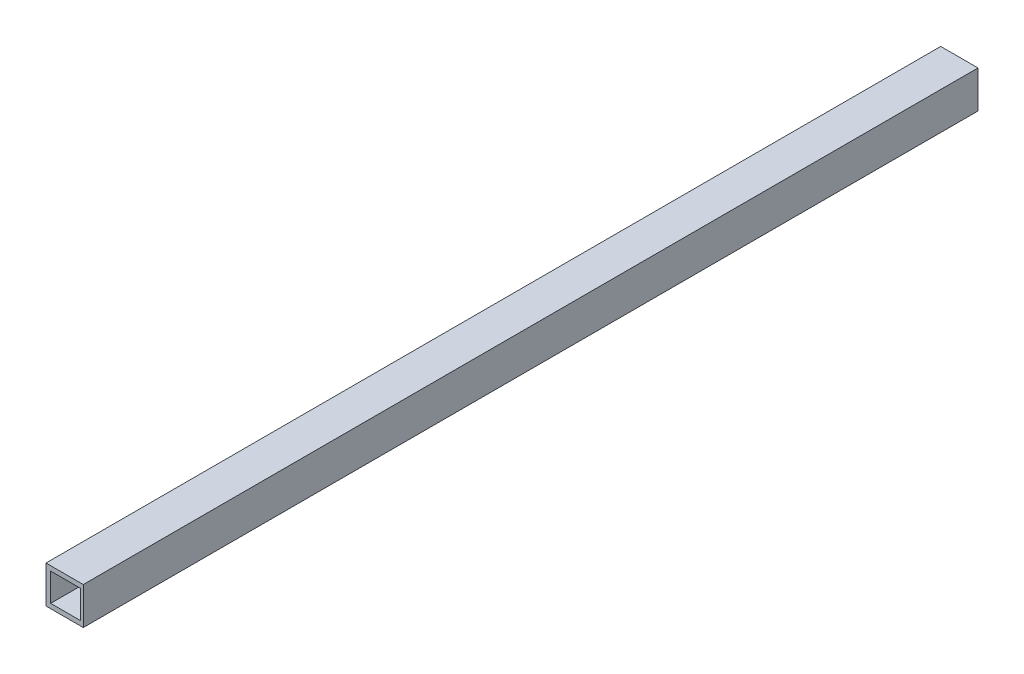
ISO-10303-21;
HEADER;
FILE_DESCRIPTION(('STEP AP214'),'2;1');
FILE_NAME('part.step','',(''),(''),'','','');
FILE_SCHEMA(('AUTOMOTIVE_DESIGN { 1 0 10303 214 1 1 1 1 }'));
ENDSEC;
DATA;
#1=APPLICATION_CONTEXT('core data for automotive mechanical design processes');
#2=APPLICATION_PROTOCOL_DEFINITION('international standard','automotive_design',2000,#1);
#3=PRODUCT_CONTEXT('',#1,'mechanical');
#4=PRODUCT('Part','Part','',(#3));
#5=PRODUCT_RELATED_PRODUCT_CATEGORY('part','',(#4));
#6=PRODUCT_DEFINITION_FORMATION('','',#4);
#7=PRODUCT_DEFINITION_CONTEXT('part definition',#1,'design');
#8=PRODUCT_DEFINITION('design','',#6,#7);
#9=PRODUCT_DEFINITION_SHAPE('','',#8);
#10=(LENGTH_UNIT() NAMED_UNIT(*) SI_UNIT(.MILLI.,.METRE.));
#11=(NAMED_UNIT(*) PLANE_ANGLE_UNIT() SI_UNIT($,.RADIAN.));
#12=(NAMED_UNIT(*) SI_UNIT($,.STERADIAN.) SOLID_ANGLE_UNIT());
#13=UNCERTAINTY_MEASURE_WITH_UNIT(LENGTH_MEASURE(1.E-05),#10,'distance_accuracy_value','');
#14=(GEOMETRIC_REPRESENTATION_CONTEXT(3) GLOBAL_UNCERTAINTY_ASSIGNED_CONTEXT((#13)) GLOBAL_UNIT_ASSIGNED_CONTEXT((#10,
#11,#12)) REPRESENTATION_CONTEXT('',''));
#15=CARTESIAN_POINT('',(0.,0.,0.));
#16=DIRECTION('',(0.,0.,1.));
#17=DIRECTION('',(1.,0.,0.));
#18=AXIS2_PLACEMENT_3D('',#15,#16,#17);
#19=CARTESIAN_POINT('',(0.,0.,609.6));
#20=DIRECTION('',(-1.,0.,0.));
#21=DIRECTION('',(0.,-1.,0.));
#22=AXIS2_PLACEMENT_3D('',#19,#20,#21);
#23=PLANE('',#22);
#24=DIRECTION('',(0.,1.,0.));
#25=VECTOR('',#24,1.);
#26=CARTESIAN_POINT('',(0.,0.,0.));
#27=LINE('',#26,#25);
#28=CARTESIAN_POINT('',(0.,0.,0.));
#29=VERTEX_POINT('',#28);
#30=CARTESIAN_POINT('',(0.,25.4,0.));
#31=VERTEX_POINT('',#30);
#32=EDGE_CURVE('E148',#29,#31,#27,.T.);
#33=ORIENTED_EDGE('',*,*,#32,.F.);
#34=DIRECTION('',(0.,0.,-1.));
#35=VECTOR('',#34,1.);
#36=CARTESIAN_POINT('',(0.,0.,609.6));
#37=LINE('',#36,#35);
#38=CARTESIAN_POINT('',(0.,0.,609.6));
#39=VERTEX_POINT('',#38);
#40=EDGE_CURVE('E11',#39,#29,#37,.T.);
#41=ORIENTED_EDGE('',*,*,#40,.F.);
#42=DIRECTION('',(0.,1.,0.));
#43=VECTOR('',#42,1.);
#44=CARTESIAN_POINT('',(0.,0.,609.6));
#45=LINE('',#44,#43);
#46=CARTESIAN_POINT('',(0.,25.4,609.6));
#47=VERTEX_POINT('',#46);
#48=EDGE_CURVE('E154',#39,#47,#45,.T.);
#49=ORIENTED_EDGE('',*,*,#48,.T.);
#50=DIRECTION('',(0.,0.,-1.));
#51=VECTOR('',#50,1.);
#52=CARTESIAN_POINT('',(0.,25.4,609.6));
#53=LINE('',#52,#51);
#54=EDGE_CURVE('E42',#47,#31,#53,.T.);
#55=ORIENTED_EDGE('',*,*,#54,.T.);
#56=EDGE_LOOP('',(#33,#41,#49,#55));
#57=FACE_BOUND('',#56,.T.);
#58=ADVANCED_FACE('F39',(#57),#23,.T.);
#59=CARTESIAN_POINT('',(0.,0.,609.6));
#60=DIRECTION('',(0.,1.,0.));
#61=DIRECTION('',(0.,0.,1.));
#62=AXIS2_PLACEMENT_3D('',#59,#60,#61);
#63=PLANE('',#62);
#64=DIRECTION('',(1.,0.,0.));
#65=VECTOR('',#64,1.);
#66=CARTESIAN_POINT('',(0.,0.,0.));
#67=LINE('',#66,#65);
#68=CARTESIAN_POINT('',(25.4,0.,0.));
#69=VERTEX_POINT('',#68);
#70=EDGE_CURVE('E159',#29,#69,#67,.T.);
#71=ORIENTED_EDGE('',*,*,#70,.T.);
#72=DIRECTION('',(0.,0.,-1.));
#73=VECTOR('',#72,1.);
#74=CARTESIAN_POINT('',(25.4,0.,609.6));
#75=LINE('',#74,#73);
#76=CARTESIAN_POINT('',(25.4,0.,609.6));
#77=VERTEX_POINT('',#76);
#78=EDGE_CURVE('E48',#77,#69,#75,.T.);
#79=ORIENTED_EDGE('',*,*,#78,.F.);
#80=DIRECTION('',(1.,0.,0.));
#81=VECTOR('',#80,1.);
#82=CARTESIAN_POINT('',(0.,0.,609.6));
#83=LINE('',#82,#81);
#84=EDGE_CURVE('E166',#39,#77,#83,.T.);
#85=ORIENTED_EDGE('',*,*,#84,.F.);
#86=ORIENTED_EDGE('',*,*,#40,.T.);
#87=EDGE_LOOP('',(#71,#79,#85,#86));
#88=FACE_BOUND('',#87,.T.);
#89=ADVANCED_FACE('F201',(#88),#63,.F.);
#90=CARTESIAN_POINT('',(25.4,0.,609.6));
#91=DIRECTION('',(-1.,0.,0.));
#92=DIRECTION('',(0.,-1.,0.));
#93=AXIS2_PLACEMENT_3D('',#90,#91,#92);
#94=PLANE('',#93);
#95=DIRECTION('',(0.,1.,0.));
#96=VECTOR('',#95,1.);
#97=CARTESIAN_POINT('',(25.4,0.,0.));
#98=LINE('',#97,#96);
#99=CARTESIAN_POINT('',(25.4,25.4,0.));
#100=VERTEX_POINT('',#99);
#101=EDGE_CURVE('E176',#69,#100,#98,.T.);
#102=ORIENTED_EDGE('',*,*,#101,.T.);
#103=DIRECTION('',(0.,0.,-1.));
#104=VECTOR('',#103,1.);
#105=CARTESIAN_POINT('',(25.4,25.4,609.6));
#106=LINE('',#105,#104);
#107=CARTESIAN_POINT('',(25.4,25.4,609.6));
#108=VERTEX_POINT('',#107);
#109=EDGE_CURVE('E184',#108,#100,#106,.T.);
#110=ORIENTED_EDGE('',*,*,#109,.F.);
#111=DIRECTION('',(0.,1.,0.));
#112=VECTOR('',#111,1.);
#113=CARTESIAN_POINT('',(25.4,0.,609.6));
#114=LINE('',#113,#112);
#115=EDGE_CURVE('E163',#77,#108,#114,.T.);
#116=ORIENTED_EDGE('',*,*,#115,.F.);
#117=ORIENTED_EDGE('',*,*,#78,.T.);
#118=EDGE_LOOP('',(#102,#110,#116,#117));
#119=FACE_BOUND('',#118,.T.);
#120=ADVANCED_FACE('F205',(#119),#94,.F.);
#121=CARTESIAN_POINT('',(0.,25.4,609.6));
#122=DIRECTION('',(0.,1.,0.));
#123=DIRECTION('',(0.,0.,1.));
#124=AXIS2_PLACEMENT_3D('',#121,#122,#123);
#125=PLANE('',#124);
#126=DIRECTION('',(1.,0.,0.));
#127=VECTOR('',#126,1.);
#128=CARTESIAN_POINT('',(0.,25.4,0.));
#129=LINE('',#128,#127);
#130=EDGE_CURVE('E172',#31,#100,#129,.T.);
#131=ORIENTED_EDGE('',*,*,#130,.F.);
#132=ORIENTED_EDGE('',*,*,#54,.F.);
#133=DIRECTION('',(1.,0.,0.));
#134=VECTOR('',#133,1.);
#135=CARTESIAN_POINT('',(0.,25.4,609.6));
#136=LINE('',#135,#134);
#137=EDGE_CURVE('E158',#47,#108,#136,.T.);
#138=ORIENTED_EDGE('',*,*,#137,.T.);
#139=ORIENTED_EDGE('',*,*,#109,.T.);
#140=EDGE_LOOP('',(#131,#132,#138,#139));
#141=FACE_BOUND('',#140,.T.);
#142=ADVANCED_FACE('F194',(#141),#125,.T.);
#143=CARTESIAN_POINT('',(0.,0.,609.6));
#144=DIRECTION('',(0.,0.,-1.));
#145=DIRECTION('',(-1.,0.,0.));
#146=AXIS2_PLACEMENT_3D('',#143,#144,#145);
#147=PLANE('',#146);
#148=DIRECTION('',(1.,0.,0.));
#149=VECTOR('',#148,1.);
#150=CARTESIAN_POINT('',(23.4777661909682,22.225,609.6));
#151=LINE('',#150,#149);
#152=CARTESIAN_POINT('',(3.175,22.225,609.6));
#153=VERTEX_POINT('',#152);
#154=CARTESIAN_POINT('',(23.4777661909682,22.225,609.6));
#155=VERTEX_POINT('',#154);
#156=EDGE_CURVE('E114',#153,#155,#151,.T.);
#157=ORIENTED_EDGE('',*,*,#156,.T.);
#158=DIRECTION('',(0.,-1.,0.));
#159=VECTOR('',#158,1.);
#160=CARTESIAN_POINT('',(23.4777661909682,22.225,609.6));
#161=LINE('',#160,#159);
#162=CARTESIAN_POINT('',(23.4777661909682,3.175,609.6));
#163=VERTEX_POINT('',#162);
#164=EDGE_CURVE('E107',#155,#163,#161,.T.);
#165=ORIENTED_EDGE('',*,*,#164,.T.);
#166=DIRECTION('',(-1.,0.,0.));
#167=VECTOR('',#166,1.);
#168=CARTESIAN_POINT('',(23.4777661909682,3.175,609.6));
#169=LINE('',#168,#167);
#170=CARTESIAN_POINT('',(3.175,3.175,609.6));
#171=VERTEX_POINT('',#170);
#172=EDGE_CURVE('E117',#163,#171,#169,.T.);
#173=ORIENTED_EDGE('',*,*,#172,.T.);
#174=DIRECTION('',(0.,1.,0.));
#175=VECTOR('',#174,1.);
#176=CARTESIAN_POINT('',(3.175,22.225,609.6));
#177=LINE('',#176,#175);
#178=EDGE_CURVE('E56',#171,#153,#177,.T.);
#179=ORIENTED_EDGE('',*,*,#178,.T.);
#180=EDGE_LOOP('',(#157,#165,#173,#179));
#181=FACE_BOUND('',#180,.T.);
#182=ORIENTED_EDGE('',*,*,#48,.F.);
#183=ORIENTED_EDGE('',*,*,#84,.T.);
#184=ORIENTED_EDGE('',*,*,#115,.T.);
#185=ORIENTED_EDGE('',*,*,#137,.F.);
#186=EDGE_LOOP('',(#182,#183,#184,#185));
#187=FACE_BOUND('',#186,.T.);
#188=ADVANCED_FACE('F122',(#181,#187),#147,.F.);
#189=CARTESIAN_POINT('',(0.,0.,0.));
#190=DIRECTION('',(0.,0.,-1.));
#191=DIRECTION('',(-1.,0.,0.));
#192=AXIS2_PLACEMENT_3D('',#189,#190,#191);
#193=PLANE('',#192);
#194=DIRECTION('',(0.,-1.,0.));
#195=VECTOR('',#194,1.);
#196=CARTESIAN_POINT('',(23.4777661909682,22.225,0.));
#197=LINE('',#196,#195);
#198=CARTESIAN_POINT('',(23.4777661909682,22.225,0.));
#199=VERTEX_POINT('',#198);
#200=CARTESIAN_POINT('',(23.4777661909682,3.175,0.));
#201=VERTEX_POINT('',#200);
#202=EDGE_CURVE('E64',#199,#201,#197,.T.);
#203=ORIENTED_EDGE('',*,*,#202,.F.);
#204=DIRECTION('',(1.,0.,0.));
#205=VECTOR('',#204,1.);
#206=CARTESIAN_POINT('',(23.4777661909682,22.225,0.));
#207=LINE('',#206,#205);
#208=CARTESIAN_POINT('',(3.175,22.225,0.));
#209=VERTEX_POINT('',#208);
#210=EDGE_CURVE('E126',#209,#199,#207,.T.);
#211=ORIENTED_EDGE('',*,*,#210,.F.);
#212=DIRECTION('',(0.,1.,0.));
#213=VECTOR('',#212,1.);
#214=CARTESIAN_POINT('',(3.175,22.225,0.));
#215=LINE('',#214,#213);
#216=CARTESIAN_POINT('',(3.175,3.175,0.));
#217=VERTEX_POINT('',#216);
#218=EDGE_CURVE('E130',#217,#209,#215,.T.);
#219=ORIENTED_EDGE('',*,*,#218,.F.);
#220=DIRECTION('',(-1.,0.,0.));
#221=VECTOR('',#220,1.);
#222=CARTESIAN_POINT('',(23.4777661909682,3.175,0.));
#223=LINE('',#222,#221);
#224=EDGE_CURVE('E139',#201,#217,#223,.T.);
#225=ORIENTED_EDGE('',*,*,#224,.F.);
#226=EDGE_LOOP('',(#203,#211,#219,#225));
#227=FACE_BOUND('',#226,.T.);
#228=ORIENTED_EDGE('',*,*,#32,.T.);
#229=ORIENTED_EDGE('',*,*,#130,.T.);
#230=ORIENTED_EDGE('',*,*,#101,.F.);
#231=ORIENTED_EDGE('',*,*,#70,.F.);
#232=EDGE_LOOP('',(#228,#229,#230,#231));
#233=FACE_BOUND('',#232,.T.);
#234=ADVANCED_FACE('F198',(#227,#233),#193,.T.);
#235=CARTESIAN_POINT('',(23.4777661909682,22.225,609.6));
#236=DIRECTION('',(1.,0.,0.));
#237=DIRECTION('',(0.,1.,0.));
#238=AXIS2_PLACEMENT_3D('',#235,#236,#237);
#239=PLANE('',#238);
#240=ORIENTED_EDGE('',*,*,#202,.T.);
#241=DIRECTION('',(0.,0.,-1.));
#242=VECTOR('',#241,1.);
#243=CARTESIAN_POINT('',(23.4777661909682,3.175,609.6));
#244=LINE('',#243,#242);
#245=EDGE_CURVE('E103',#163,#201,#244,.T.);
#246=ORIENTED_EDGE('',*,*,#245,.F.);
#247=ORIENTED_EDGE('',*,*,#164,.F.);
#248=DIRECTION('',(0.,0.,-1.));
#249=VECTOR('',#248,1.);
#250=CARTESIAN_POINT('',(23.4777661909682,22.225,609.6));
#251=LINE('',#250,#249);
#252=EDGE_CURVE('E145',#155,#199,#251,.T.);
#253=ORIENTED_EDGE('',*,*,#252,.T.);
#254=EDGE_LOOP('',(#240,#246,#247,#253));
#255=FACE_BOUND('',#254,.T.);
#256=ADVANCED_FACE('F105',(#255),#239,.F.);
#257=CARTESIAN_POINT('',(23.4777661909682,22.225,609.6));
#258=DIRECTION('',(0.,1.,0.));
#259=DIRECTION('',(0.,0.,1.));
#260=AXIS2_PLACEMENT_3D('',#257,#258,#259);
#261=PLANE('',#260);
#262=ORIENTED_EDGE('',*,*,#210,.T.);
#263=ORIENTED_EDGE('',*,*,#252,.F.);
#264=ORIENTED_EDGE('',*,*,#156,.F.);
#265=DIRECTION('',(0.,0.,-1.));
#266=VECTOR('',#265,1.);
#267=CARTESIAN_POINT('',(3.175,22.225,609.6));
#268=LINE('',#267,#266);
#269=EDGE_CURVE('E149',#153,#209,#268,.T.);
#270=ORIENTED_EDGE('',*,*,#269,.T.);
#271=EDGE_LOOP('',(#262,#263,#264,#270));
#272=FACE_BOUND('',#271,.T.);
#273=ADVANCED_FACE('F249',(#272),#261,.F.);
#274=CARTESIAN_POINT('',(3.175,22.225,609.6));
#275=DIRECTION('',(-1.,0.,0.));
#276=DIRECTION('',(0.,-1.,0.));
#277=AXIS2_PLACEMENT_3D('',#274,#275,#276);
#278=PLANE('',#277);
#279=ORIENTED_EDGE('',*,*,#218,.T.);
#280=ORIENTED_EDGE('',*,*,#269,.F.);
#281=ORIENTED_EDGE('',*,*,#178,.F.);
#282=DIRECTION('',(0.,0.,-1.));
#283=VECTOR('',#282,1.);
#284=CARTESIAN_POINT('',(3.175,3.175,609.6));
#285=LINE('',#284,#283);
#286=EDGE_CURVE('E113',#171,#217,#285,.T.);
#287=ORIENTED_EDGE('',*,*,#286,.T.);
#288=EDGE_LOOP('',(#279,#280,#281,#287));
#289=FACE_BOUND('',#288,.T.);
#290=ADVANCED_FACE('F257',(#289),#278,.F.);
#291=CARTESIAN_POINT('',(23.4777661909682,3.175,609.6));
#292=DIRECTION('',(0.,-1.,0.));
#293=DIRECTION('',(0.,0.,-1.));
#294=AXIS2_PLACEMENT_3D('',#291,#292,#293);
#295=PLANE('',#294);
#296=ORIENTED_EDGE('',*,*,#224,.T.);
#297=ORIENTED_EDGE('',*,*,#286,.F.);
#298=ORIENTED_EDGE('',*,*,#172,.F.);
#299=ORIENTED_EDGE('',*,*,#245,.T.);
#300=EDGE_LOOP('',(#296,#297,#298,#299));
#301=FACE_BOUND('',#300,.T.);
#302=ADVANCED_FACE('F118',(#301),#295,.F.);
#303=CLOSED_SHELL('',(#58,#89,#120,#142,#188,#234,#256,#273,#290,#302));
#304=MANIFOLD_SOLID_BREP('B2',#303);
#305=ADVANCED_BREP_SHAPE_REPRESENTATION('',(#18,#304),#14);
#306=SHAPE_DEFINITION_REPRESENTATION(#9,#305);
ENDSEC;
END-ISO-10303-21;
